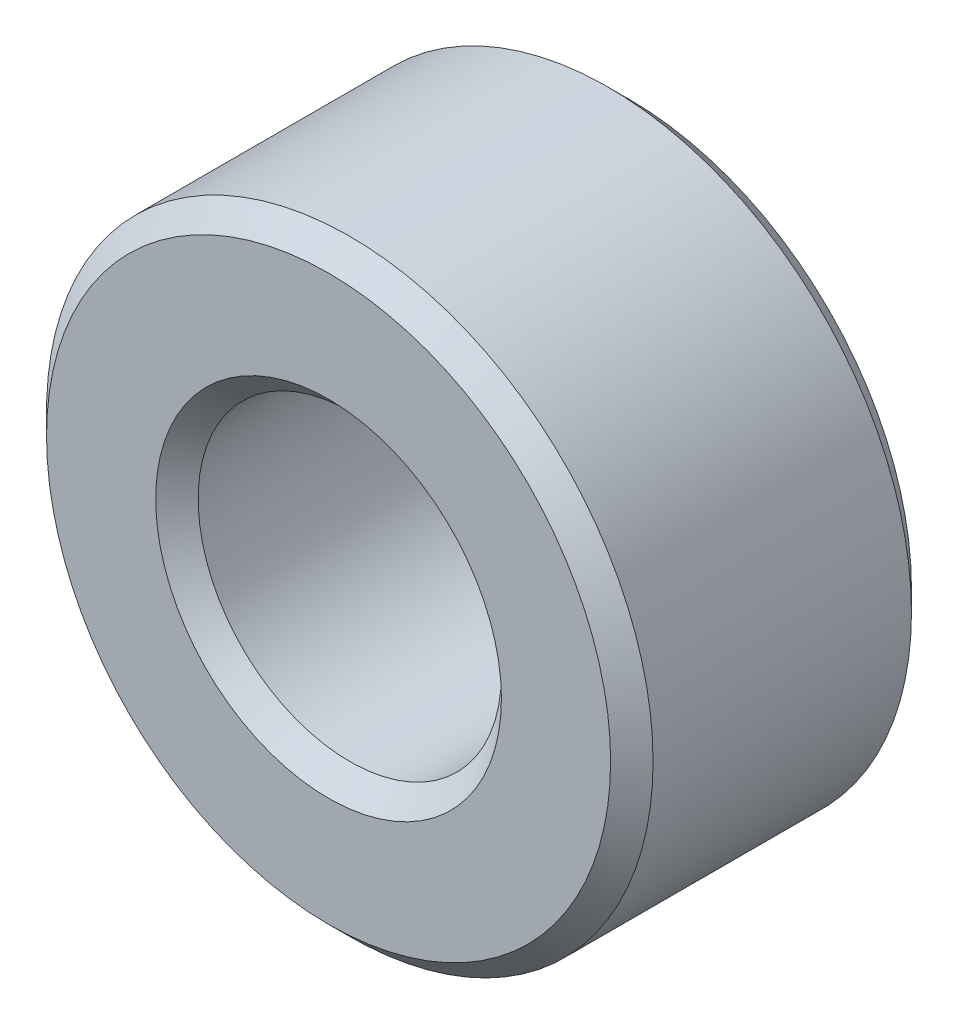
ISO-10303-21;
HEADER;
FILE_DESCRIPTION(('STEP AP214'),'2;1');
FILE_NAME('part.step','',(''),(''),'','','');
FILE_SCHEMA(('AUTOMOTIVE_DESIGN { 1 0 10303 214 1 1 1 1 }'));
ENDSEC;
DATA;
#1=APPLICATION_CONTEXT('core data for automotive mechanical design processes');
#2=APPLICATION_PROTOCOL_DEFINITION('international standard','automotive_design',2000,#1);
#3=PRODUCT_CONTEXT('',#1,'mechanical');
#4=PRODUCT('Part','Part','',(#3));
#5=PRODUCT_RELATED_PRODUCT_CATEGORY('part','',(#4));
#6=PRODUCT_DEFINITION_FORMATION('','',#4);
#7=PRODUCT_DEFINITION_CONTEXT('part definition',#1,'design');
#8=PRODUCT_DEFINITION('design','',#6,#7);
#9=PRODUCT_DEFINITION_SHAPE('','',#8);
#10=(LENGTH_UNIT() NAMED_UNIT(*) SI_UNIT(.MILLI.,.METRE.));
#11=(NAMED_UNIT(*) PLANE_ANGLE_UNIT() SI_UNIT($,.RADIAN.));
#12=(NAMED_UNIT(*) SI_UNIT($,.STERADIAN.) SOLID_ANGLE_UNIT());
#13=UNCERTAINTY_MEASURE_WITH_UNIT(LENGTH_MEASURE(1.E-05),#10,'distance_accuracy_value','');
#14=(GEOMETRIC_REPRESENTATION_CONTEXT(3) GLOBAL_UNCERTAINTY_ASSIGNED_CONTEXT((#13)) GLOBAL_UNIT_ASSIGNED_CONTEXT((#10,
#11,#12)) REPRESENTATION_CONTEXT('',''));
#15=CARTESIAN_POINT('',(0.,0.,0.));
#16=DIRECTION('',(0.,0.,1.));
#17=DIRECTION('',(1.,0.,0.));
#18=AXIS2_PLACEMENT_3D('',#15,#16,#17);
#19=CARTESIAN_POINT('',(0.,0.,-1.5875));
#20=DIRECTION('',(0.,0.,1.));
#21=DIRECTION('',(1.,0.,0.));
#22=AXIS2_PLACEMENT_3D('',#19,#20,#21);
#23=CYLINDRICAL_SURFACE('',#22,3.2004);
#24=CARTESIAN_POINT('',(0.,0.,-1.363472));
#25=DIRECTION('',(0.,0.,1.));
#26=DIRECTION('',(1.,0.,0.));
#27=AXIS2_PLACEMENT_3D('',#24,#25,#26);
#28=CIRCLE('',#27,3.2004);
#29=CARTESIAN_POINT('',(3.2004,0.,-1.363472));
#30=VERTEX_POINT('',#29);
#31=EDGE_CURVE('E76',#30,#30,#28,.T.);
#32=CARTESIAN_POINT('',(0.,0.,1.363472));
#33=DIRECTION('',(0.,0.,1.));
#34=DIRECTION('',(1.,0.,0.));
#35=AXIS2_PLACEMENT_3D('',#32,#33,#34);
#36=CIRCLE('',#35,3.2004);
#37=CARTESIAN_POINT('',(3.2004,0.,1.363472));
#38=VERTEX_POINT('',#37);
#39=EDGE_CURVE('E80',#38,#38,#36,.F.);
#40=CARTESIAN_POINT('',(3.2004,0.,-1.363472));
#41=CARTESIAN_POINT('',(3.2004,0.,-1.33506633333333));
#42=CARTESIAN_POINT('',(3.2004,0.,-1.30666066666666));
#43=CARTESIAN_POINT('',(3.2004,0.,-1.24984933333333));
#44=CARTESIAN_POINT('',(3.2004,0.,-1.22144366666666));
#45=CARTESIAN_POINT('',(3.2004,0.,-1.16463233333333));
#46=CARTESIAN_POINT('',(3.2004,0.,-1.13622666666666));
#47=CARTESIAN_POINT('',(3.2004,0.,-1.07941533333333));
#48=CARTESIAN_POINT('',(3.2004,0.,-1.05100966666666));
#49=CARTESIAN_POINT('',(3.2004,0.,-0.994198333333331));
#50=CARTESIAN_POINT('',(3.2004,0.,-0.965792666666664));
#51=CARTESIAN_POINT('',(3.2004,0.,-0.908981333333331));
#52=CARTESIAN_POINT('',(3.2004,0.,-0.880575666666664));
#53=CARTESIAN_POINT('',(3.2004,0.,-0.823764333333331));
#54=CARTESIAN_POINT('',(3.2004,0.,-0.795358666666664));
#55=CARTESIAN_POINT('',(3.2004,0.,-0.738547333333331));
#56=CARTESIAN_POINT('',(3.2004,0.,-0.710141666666664));
#57=CARTESIAN_POINT('',(3.2004,0.,-0.653330333333331));
#58=CARTESIAN_POINT('',(3.2004,0.,-0.624924666666664));
#59=CARTESIAN_POINT('',(3.2004,0.,-0.568113333333331));
#60=CARTESIAN_POINT('',(3.2004,0.,-0.539707666666665));
#61=CARTESIAN_POINT('',(3.2004,0.,-0.482896333333331));
#62=CARTESIAN_POINT('',(3.2004,0.,-0.454490666666665));
#63=CARTESIAN_POINT('',(3.2004,0.,-0.397679333333332));
#64=CARTESIAN_POINT('',(3.2004,0.,-0.369273666666665));
#65=CARTESIAN_POINT('',(3.2004,0.,-0.312462333333332));
#66=CARTESIAN_POINT('',(3.2004,0.,-0.284056666666665));
#67=CARTESIAN_POINT('',(3.2004,0.,-0.227245333333332));
#68=CARTESIAN_POINT('',(3.2004,0.,-0.198839666666665));
#69=CARTESIAN_POINT('',(3.2004,0.,-0.142028333333332));
#70=CARTESIAN_POINT('',(3.2004,0.,-0.113622666666665));
#71=CARTESIAN_POINT('',(3.2004,0.,-0.0568113333333317));
#72=CARTESIAN_POINT('',(3.2004,0.,-0.0284056666666651));
#73=CARTESIAN_POINT('',(3.2004,0.,0.0284056666666681));
#74=CARTESIAN_POINT('',(3.2004,0.,0.0568113333333348));
#75=CARTESIAN_POINT('',(3.2004,0.,0.113622666666668));
#76=CARTESIAN_POINT('',(3.2004,0.,0.142028333333335));
#77=CARTESIAN_POINT('',(3.2004,0.,0.198839666666668));
#78=CARTESIAN_POINT('',(3.2004,0.,0.227245333333334));
#79=CARTESIAN_POINT('',(3.2004,0.,0.284056666666668));
#80=CARTESIAN_POINT('',(3.2004,0.,0.312462333333334));
#81=CARTESIAN_POINT('',(3.2004,0.,0.369273666666667));
#82=CARTESIAN_POINT('',(3.2004,0.,0.397679333333334));
#83=CARTESIAN_POINT('',(3.2004,0.,0.454490666666667));
#84=CARTESIAN_POINT('',(3.2004,0.,0.482896333333334));
#85=CARTESIAN_POINT('',(3.2004,0.,0.539707666666667));
#86=CARTESIAN_POINT('',(3.2004,0.,0.568113333333334));
#87=CARTESIAN_POINT('',(3.2004,0.,0.624924666666667));
#88=CARTESIAN_POINT('',(3.2004,0.,0.653330333333334));
#89=CARTESIAN_POINT('',(3.2004,0.,0.710141666666667));
#90=CARTESIAN_POINT('',(3.2004,0.,0.738547333333334));
#91=CARTESIAN_POINT('',(3.2004,0.,0.795358666666667));
#92=CARTESIAN_POINT('',(3.2004,0.,0.823764333333334));
#93=CARTESIAN_POINT('',(3.2004,0.,0.880575666666667));
#94=CARTESIAN_POINT('',(3.2004,0.,0.908981333333333));
#95=CARTESIAN_POINT('',(3.2004,0.,0.965792666666667));
#96=CARTESIAN_POINT('',(3.2004,0.,0.994198333333334));
#97=CARTESIAN_POINT('',(3.2004,0.,1.05100966666667));
#98=CARTESIAN_POINT('',(3.2004,0.,1.07941533333333));
#99=CARTESIAN_POINT('',(3.2004,0.,1.13622666666667));
#100=CARTESIAN_POINT('',(3.2004,0.,1.16463233333333));
#101=CARTESIAN_POINT('',(3.2004,0.,1.22144366666667));
#102=CARTESIAN_POINT('',(3.2004,0.,1.24984933333333));
#103=CARTESIAN_POINT('',(3.2004,0.,1.30666066666667));
#104=CARTESIAN_POINT('',(3.2004,0.,1.33506633333333));
#105=CARTESIAN_POINT('',(3.2004,0.,1.363472));
#106=B_SPLINE_CURVE_WITH_KNOTS('',3,(#40,#41,#42,#43,#44,#45,#46,#47,#48,#49,#50,#51,#52,#53,
#54,#55,#56,#57,#58,#59,#60,#61,#62,#63,#64,#65,#66,#67,#68,#69,#70,#71,#72,#73,#74,#75,#76,#77,
#78,#79,#80,#81,#82,#83,#84,#85,#86,#87,#88,#89,#90,#91,#92,#93,#94,#95,#96,#97,#98,#99,#100,
#101,#102,#103,#104,#105),.UNSPECIFIED.,.F.,.F.,(4,2,2,2,2,2,2,2,2,2,2,2,2,2,2,2,2,2,2,2,2,2,2,
2,2,2,2,2,2,2,2,2,4),(0.,0.0852170000000001,0.170434,0.255651,0.340868,0.426085,
0.511301999999999,0.596518999999999,0.681735999999999,0.766952999999999,0.852169999999999,
0.937386999999999,1.022604,1.107821,1.193038,1.278255,1.363472,1.448689,1.533906,1.619123,
1.70434,1.789557,1.874774,1.959991,2.045208,2.130425,2.215642,2.300859,2.386076,2.471293,
2.55651,2.641727,2.726944),.UNSPECIFIED.);
#107=EDGE_CURVE('BSEAM41',#30,#38,#106,.T.);
#108=ORIENTED_EDGE('',*,*,#31,.T.);
#109=ORIENTED_EDGE('',*,*,#39,.T.);
#110=ORIENTED_EDGE('',*,*,#107,.T.);
#111=ORIENTED_EDGE('',*,*,#107,.F.);
#112=EDGE_LOOP('',(#108,#110,#109,#111));
#113=FACE_BOUND('',#112,.T.);
#114=ADVANCED_FACE('F41',(#113),#23,.T.);
#115=CARTESIAN_POINT('',(0.,0.,-1.5875));
#116=DIRECTION('',(0.,0.,1.));
#117=DIRECTION('',(1.,0.,0.));
#118=AXIS2_PLACEMENT_3D('',#115,#116,#117);
#119=PLANE('',#118);
#120=CARTESIAN_POINT('',(0.,0.,-1.5875));
#121=DIRECTION('',(0.,0.,1.));
#122=DIRECTION('',(1.,0.,0.));
#123=AXIS2_PLACEMENT_3D('',#120,#121,#122);
#124=CIRCLE('',#123,2.97637199999999);
#125=CARTESIAN_POINT('',(2.97637199999999,0.,-1.5875));
#126=VERTEX_POINT('',#125);
#127=EDGE_CURVE('E68',#126,#126,#124,.F.);
#128=ORIENTED_EDGE('',*,*,#127,.T.);
#129=EDGE_LOOP('',(#128));
#130=FACE_BOUND('',#129,.T.);
#131=CARTESIAN_POINT('',(0.,0.,-1.5875));
#132=DIRECTION('',(0.,0.,1.));
#133=DIRECTION('',(1.,0.,0.));
#134=AXIS2_PLACEMENT_3D('',#131,#132,#133);
#135=CIRCLE('',#134,1.824228);
#136=CARTESIAN_POINT('',(1.824228,0.,-1.5875));
#137=VERTEX_POINT('',#136);
#138=EDGE_CURVE('E72',#137,#137,#135,.T.);
#139=ORIENTED_EDGE('',*,*,#138,.T.);
#140=EDGE_LOOP('',(#139));
#141=FACE_BOUND('',#140,.T.);
#142=ADVANCED_FACE('F96',(#130,#141),#119,.F.);
#143=CARTESIAN_POINT('',(0.,0.,-1.5875));
#144=DIRECTION('',(0.,0.,1.));
#145=DIRECTION('',(1.,0.,0.));
#146=AXIS2_PLACEMENT_3D('',#143,#144,#145);
#147=CYLINDRICAL_SURFACE('',#146,1.6002);
#148=CARTESIAN_POINT('',(0.,0.,-1.363472));
#149=DIRECTION('',(0.,0.,1.));
#150=DIRECTION('',(1.,0.,0.));
#151=AXIS2_PLACEMENT_3D('',#148,#149,#150);
#152=CIRCLE('',#151,1.6002);
#153=CARTESIAN_POINT('',(1.6002,0.,-1.363472));
#154=VERTEX_POINT('',#153);
#155=EDGE_CURVE('E56',#154,#154,#152,.F.);
#156=CARTESIAN_POINT('',(0.,0.,1.36347199999999));
#157=DIRECTION('',(0.,0.,1.));
#158=DIRECTION('',(1.,0.,0.));
#159=AXIS2_PLACEMENT_3D('',#156,#157,#158);
#160=CIRCLE('',#159,1.6002);
#161=CARTESIAN_POINT('',(1.6002,0.,1.36347199999999));
#162=VERTEX_POINT('',#161);
#163=EDGE_CURVE('E62',#162,#162,#160,.T.);
#164=CARTESIAN_POINT('',(1.6002,0.,-1.363472));
#165=CARTESIAN_POINT('',(1.6002,0.,-1.33506633333334));
#166=CARTESIAN_POINT('',(1.6002,0.,-1.30666066666667));
#167=CARTESIAN_POINT('',(1.6002,0.,-1.24984933333334));
#168=CARTESIAN_POINT('',(1.6002,0.,-1.22144366666667));
#169=CARTESIAN_POINT('',(1.6002,0.,-1.16463233333334));
#170=CARTESIAN_POINT('',(1.6002,0.,-1.13622666666667));
#171=CARTESIAN_POINT('',(1.6002,0.,-1.07941533333334));
#172=CARTESIAN_POINT('',(1.6002,0.,-1.05100966666667));
#173=CARTESIAN_POINT('',(1.6002,0.,-0.994198333333337));
#174=CARTESIAN_POINT('',(1.6002,0.,-0.96579266666667));
#175=CARTESIAN_POINT('',(1.6002,0.,-0.908981333333337));
#176=CARTESIAN_POINT('',(1.6002,0.,-0.88057566666667));
#177=CARTESIAN_POINT('',(1.6002,0.,-0.823764333333337));
#178=CARTESIAN_POINT('',(1.6002,0.,-0.79535866666667));
#179=CARTESIAN_POINT('',(1.6002,0.,-0.738547333333337));
#180=CARTESIAN_POINT('',(1.6002,0.,-0.71014166666667));
#181=CARTESIAN_POINT('',(1.6002,0.,-0.653330333333337));
#182=CARTESIAN_POINT('',(1.6002,0.,-0.62492466666667));
#183=CARTESIAN_POINT('',(1.6002,0.,-0.568113333333337));
#184=CARTESIAN_POINT('',(1.6002,0.,-0.539707666666671));
#185=CARTESIAN_POINT('',(1.6002,0.,-0.482896333333337));
#186=CARTESIAN_POINT('',(1.6002,0.,-0.454490666666671));
#187=CARTESIAN_POINT('',(1.6002,0.,-0.397679333333337));
#188=CARTESIAN_POINT('',(1.6002,0.,-0.369273666666671));
#189=CARTESIAN_POINT('',(1.6002,0.,-0.312462333333338));
#190=CARTESIAN_POINT('',(1.6002,0.,-0.284056666666671));
#191=CARTESIAN_POINT('',(1.6002,0.,-0.227245333333338));
#192=CARTESIAN_POINT('',(1.6002,0.,-0.198839666666671));
#193=CARTESIAN_POINT('',(1.6002,0.,-0.142028333333338));
#194=CARTESIAN_POINT('',(1.6002,0.,-0.113622666666671));
#195=CARTESIAN_POINT('',(1.6002,0.,-0.056811333333338));
#196=CARTESIAN_POINT('',(1.6002,0.,-0.0284056666666714));
#197=CARTESIAN_POINT('',(1.6002,0.,0.0284056666666618));
#198=CARTESIAN_POINT('',(1.6002,0.,0.0568113333333285));
#199=CARTESIAN_POINT('',(1.6002,0.,0.113622666666662));
#200=CARTESIAN_POINT('',(1.6002,0.,0.142028333333328));
#201=CARTESIAN_POINT('',(1.6002,0.,0.198839666666662));
#202=CARTESIAN_POINT('',(1.6002,0.,0.227245333333328));
#203=CARTESIAN_POINT('',(1.6002,0.,0.284056666666661));
#204=CARTESIAN_POINT('',(1.6002,0.,0.312462333333328));
#205=CARTESIAN_POINT('',(1.6002,0.,0.369273666666661));
#206=CARTESIAN_POINT('',(1.6002,0.,0.397679333333328));
#207=CARTESIAN_POINT('',(1.6002,0.,0.454490666666661));
#208=CARTESIAN_POINT('',(1.6002,0.,0.482896333333328));
#209=CARTESIAN_POINT('',(1.6002,0.,0.539707666666661));
#210=CARTESIAN_POINT('',(1.6002,0.,0.568113333333327));
#211=CARTESIAN_POINT('',(1.6002,0.,0.62492466666666));
#212=CARTESIAN_POINT('',(1.6002,0.,0.653330333333327));
#213=CARTESIAN_POINT('',(1.6002,0.,0.710141666666661));
#214=CARTESIAN_POINT('',(1.6002,0.,0.738547333333327));
#215=CARTESIAN_POINT('',(1.6002,0.,0.79535866666666));
#216=CARTESIAN_POINT('',(1.6002,0.,0.823764333333327));
#217=CARTESIAN_POINT('',(1.6002,0.,0.88057566666666));
#218=CARTESIAN_POINT('',(1.6002,0.,0.908981333333327));
#219=CARTESIAN_POINT('',(1.6002,0.,0.96579266666666));
#220=CARTESIAN_POINT('',(1.6002,0.,0.994198333333327));
#221=CARTESIAN_POINT('',(1.6002,0.,1.05100966666666));
#222=CARTESIAN_POINT('',(1.6002,0.,1.07941533333333));
#223=CARTESIAN_POINT('',(1.6002,0.,1.13622666666666));
#224=CARTESIAN_POINT('',(1.6002,0.,1.16463233333333));
#225=CARTESIAN_POINT('',(1.6002,0.,1.22144366666666));
#226=CARTESIAN_POINT('',(1.6002,0.,1.24984933333333));
#227=CARTESIAN_POINT('',(1.6002,0.,1.30666066666666));
#228=CARTESIAN_POINT('',(1.6002,0.,1.33506633333333));
#229=CARTESIAN_POINT('',(1.6002,0.,1.36347199999999));
#230=B_SPLINE_CURVE_WITH_KNOTS('',3,(#164,#165,#166,#167,#168,#169,#170,#171,#172,#173,#174,
#175,#176,#177,#178,#179,#180,#181,#182,#183,#184,#185,#186,#187,#188,#189,#190,#191,#192,#193,
#194,#195,#196,#197,#198,#199,#200,#201,#202,#203,#204,#205,#206,#207,#208,#209,#210,#211,#212,
#213,#214,#215,#216,#217,#218,#219,#220,#221,#222,#223,#224,#225,#226,#227,#228,#229),
.UNSPECIFIED.,.F.,.F.,(4,2,2,2,2,2,2,2,2,2,2,2,2,2,2,2,2,2,2,2,2,2,2,2,2,2,2,2,2,2,2,2,4),(0.,
0.0852169999999998,0.170434,0.255651,0.340867999999999,0.426084999999999,0.511301999999999,
0.596518999999999,0.681735999999999,0.766952999999999,0.852169999999998,0.937386999999998,
1.022604,1.107821,1.193038,1.278255,1.363472,1.448689,1.533906,1.619123,1.70434,1.789557,
1.874774,1.959991,2.045208,2.130425,2.215642,2.300859,2.386076,2.471293,2.55651,2.641727,
2.726944),.UNSPECIFIED.);
#231=EDGE_CURVE('BSEAM102',#154,#162,#230,.T.);
#232=ORIENTED_EDGE('',*,*,#155,.T.);
#233=ORIENTED_EDGE('',*,*,#163,.T.);
#234=ORIENTED_EDGE('',*,*,#231,.T.);
#235=ORIENTED_EDGE('',*,*,#231,.F.);
#236=EDGE_LOOP('',(#232,#234,#233,#235));
#237=FACE_BOUND('',#236,.T.);
#238=ADVANCED_FACE('F102',(#237),#147,.F.);
#239=CARTESIAN_POINT('',(0.,0.,1.5875));
#240=DIRECTION('',(0.,0.,1.));
#241=DIRECTION('',(1.,0.,0.));
#242=AXIS2_PLACEMENT_3D('',#239,#240,#241);
#243=PLANE('',#242);
#244=CARTESIAN_POINT('',(0.,0.,1.5875));
#245=DIRECTION('',(0.,0.,1.));
#246=DIRECTION('',(1.,0.,0.));
#247=AXIS2_PLACEMENT_3D('',#244,#245,#246);
#248=CIRCLE('',#247,1.82422800000001);
#249=CARTESIAN_POINT('',(1.82422800000001,0.,1.5875));
#250=VERTEX_POINT('',#249);
#251=EDGE_CURVE('E10',#250,#250,#248,.F.);
#252=ORIENTED_EDGE('',*,*,#251,.T.);
#253=EDGE_LOOP('',(#252));
#254=FACE_BOUND('',#253,.T.);
#255=CARTESIAN_POINT('',(0.,0.,1.5875));
#256=DIRECTION('',(0.,0.,1.));
#257=DIRECTION('',(1.,0.,0.));
#258=AXIS2_PLACEMENT_3D('',#255,#256,#257);
#259=CIRCLE('',#258,2.976372);
#260=CARTESIAN_POINT('',(2.976372,0.,1.5875));
#261=VERTEX_POINT('',#260);
#262=EDGE_CURVE('E50',#261,#261,#259,.T.);
#263=ORIENTED_EDGE('',*,*,#262,.T.);
#264=EDGE_LOOP('',(#263));
#265=FACE_BOUND('',#264,.T.);
#266=ADVANCED_FACE('F114',(#254,#265),#243,.T.);
#267=CARTESIAN_POINT('',(0.,0.,-1.363472));
#268=DIRECTION('',(0.,0.,1.));
#269=DIRECTION('',(1.,0.,0.));
#270=AXIS2_PLACEMENT_3D('',#267,#268,#269);
#271=CONICAL_SURFACE('',#270,3.2004,0.78539816339745);
#272=CARTESIAN_POINT('',(2.97637199999999,0.,-1.5875));
#273=CARTESIAN_POINT('',(2.97870562499999,0.,-1.585166375));
#274=CARTESIAN_POINT('',(2.98103924999999,0.,-1.58283275));
#275=CARTESIAN_POINT('',(2.98570649999999,0.,-1.5781655));
#276=CARTESIAN_POINT('',(2.98804012499999,0.,-1.575831875));
#277=CARTESIAN_POINT('',(2.99270737499999,0.,-1.571164625));
#278=CARTESIAN_POINT('',(2.99504099999999,0.,-1.568831));
#279=CARTESIAN_POINT('',(2.99970824999999,0.,-1.56416375));
#280=CARTESIAN_POINT('',(3.00204187499999,0.,-1.561830125));
#281=CARTESIAN_POINT('',(3.00670912499999,0.,-1.557162875));
#282=CARTESIAN_POINT('',(3.00904274999999,0.,-1.55482925));
#283=CARTESIAN_POINT('',(3.01370999999999,0.,-1.550162));
#284=CARTESIAN_POINT('',(3.01604362499999,0.,-1.547828375));
#285=CARTESIAN_POINT('',(3.02071087499999,0.,-1.543161125));
#286=CARTESIAN_POINT('',(3.02304449999999,0.,-1.5408275));
#287=CARTESIAN_POINT('',(3.02771175,0.,-1.53616025));
#288=CARTESIAN_POINT('',(3.03004537499999,0.,-1.533826625));
#289=CARTESIAN_POINT('',(3.034712625,0.,-1.529159375));
#290=CARTESIAN_POINT('',(3.03704625,0.,-1.52682575));
#291=CARTESIAN_POINT('',(3.0417135,0.,-1.5221585));
#292=CARTESIAN_POINT('',(3.044047125,0.,-1.519824875));
#293=CARTESIAN_POINT('',(3.048714375,0.,-1.515157625));
#294=CARTESIAN_POINT('',(3.051048,0.,-1.512824));
#295=CARTESIAN_POINT('',(3.05571525,0.,-1.50815675));
#296=CARTESIAN_POINT('',(3.058048875,0.,-1.505823125));
#297=CARTESIAN_POINT('',(3.062716125,0.,-1.501155875));
#298=CARTESIAN_POINT('',(3.06504975,0.,-1.49882225));
#299=CARTESIAN_POINT('',(3.069717,0.,-1.494155));
#300=CARTESIAN_POINT('',(3.072050625,0.,-1.491821375));
#301=CARTESIAN_POINT('',(3.076717875,0.,-1.487154125));
#302=CARTESIAN_POINT('',(3.0790515,0.,-1.4848205));
#303=CARTESIAN_POINT('',(3.08371875,0.,-1.48015325));
#304=CARTESIAN_POINT('',(3.086052375,0.,-1.477819625));
#305=CARTESIAN_POINT('',(3.090719625,0.,-1.473152375));
#306=CARTESIAN_POINT('',(3.09305325,0.,-1.47081875));
#307=CARTESIAN_POINT('',(3.0977205,0.,-1.4661515));
#308=CARTESIAN_POINT('',(3.100054125,0.,-1.463817875));
#309=CARTESIAN_POINT('',(3.104721375,0.,-1.459150625));
#310=CARTESIAN_POINT('',(3.107055,0.,-1.456817));
#311=CARTESIAN_POINT('',(3.11172225,0.,-1.45214975));
#312=CARTESIAN_POINT('',(3.114055875,0.,-1.449816125));
#313=CARTESIAN_POINT('',(3.118723125,0.,-1.445148875));
#314=CARTESIAN_POINT('',(3.12105675,0.,-1.44281525));
#315=CARTESIAN_POINT('',(3.125724,0.,-1.438148));
#316=CARTESIAN_POINT('',(3.128057625,0.,-1.435814375));
#317=CARTESIAN_POINT('',(3.132724875,0.,-1.431147125));
#318=CARTESIAN_POINT('',(3.1350585,0.,-1.4288135));
#319=CARTESIAN_POINT('',(3.13972575,0.,-1.42414625));
#320=CARTESIAN_POINT('',(3.142059375,0.,-1.421812625));
#321=CARTESIAN_POINT('',(3.146726625,0.,-1.417145375));
#322=CARTESIAN_POINT('',(3.14906025,0.,-1.41481175));
#323=CARTESIAN_POINT('',(3.1537275,0.,-1.4101445));
#324=CARTESIAN_POINT('',(3.156061125,0.,-1.407810875));
#325=CARTESIAN_POINT('',(3.160728375,0.,-1.403143625));
#326=CARTESIAN_POINT('',(3.163062,0.,-1.40081));
#327=CARTESIAN_POINT('',(3.16772925,0.,-1.39614275));
#328=CARTESIAN_POINT('',(3.170062875,0.,-1.393809125));
#329=CARTESIAN_POINT('',(3.174730125,0.,-1.389141875));
#330=CARTESIAN_POINT('',(3.17706375,0.,-1.38680825));
#331=CARTESIAN_POINT('',(3.181731,0.,-1.382141));
#332=CARTESIAN_POINT('',(3.184064625,0.,-1.379807375));
#333=CARTESIAN_POINT('',(3.188731875,0.,-1.375140125));
#334=CARTESIAN_POINT('',(3.1910655,0.,-1.3728065));
#335=CARTESIAN_POINT('',(3.19573275,0.,-1.36813925));
#336=CARTESIAN_POINT('',(3.198066375,0.,-1.365805625));
#337=CARTESIAN_POINT('',(3.2004,0.,-1.363472));
#338=B_SPLINE_CURVE_WITH_KNOTS('',3,(#272,#273,#274,#275,#276,#277,#278,#279,#280,#281,#282,
#283,#284,#285,#286,#287,#288,#289,#290,#291,#292,#293,#294,#295,#296,#297,#298,#299,#300,#301,
#302,#303,#304,#305,#306,#307,#308,#309,#310,#311,#312,#313,#314,#315,#316,#317,#318,#319,#320,
#321,#322,#323,#324,#325,#326,#327,#328,#329,#330,#331,#332,#333,#334,#335,#336,#337),
.UNSPECIFIED.,.F.,.F.,(4,2,2,2,2,2,2,2,2,2,2,2,2,2,2,2,2,2,2,2,2,2,2,2,2,2,2,2,2,2,2,2,4),(0.,
0.00990073237347894,0.0198014647469579,0.029702197120437,0.0396029294939159,0.0495036618673947,
0.059404394240874,0.0693051266143529,0.079205858987832,0.089106591361311,0.0990073237347899,
0.108908056108269,0.118808788481748,0.128709520855227,0.138610253228706,0.148510985602185,
0.158411717975664,0.168312450349143,0.178213182722622,0.188113915096101,0.19801464746958,
0.207915379843059,0.217816112216538,0.227716844590017,0.237617576963496,0.247518309336975,
0.257419041710454,0.267319774083933,0.277220506457412,0.287121238830891,0.29702197120437,
0.306922703577849,0.316823435951328),.UNSPECIFIED.);
#339=EDGE_CURVE('BSEAM108',#126,#30,#338,.T.);
#340=ORIENTED_EDGE('',*,*,#127,.F.);
#341=ORIENTED_EDGE('',*,*,#31,.F.);
#342=ORIENTED_EDGE('',*,*,#339,.T.);
#343=ORIENTED_EDGE('',*,*,#339,.F.);
#344=EDGE_LOOP('',(#340,#342,#341,#343));
#345=FACE_BOUND('',#344,.T.);
#346=ADVANCED_FACE('F108',(#345),#271,.T.);
#347=CARTESIAN_POINT('',(0.,0.,-1.5875));
#348=DIRECTION('',(0.,0.,-1.));
#349=DIRECTION('',(-1.,0.,0.));
#350=AXIS2_PLACEMENT_3D('',#347,#348,#349);
#351=CONICAL_SURFACE('',#350,1.824228,0.785398163397445);
#352=ORIENTED_EDGE('',*,*,#155,.F.);
#353=EDGE_LOOP('',(#352));
#354=FACE_BOUND('',#353,.T.);
#355=ORIENTED_EDGE('',*,*,#138,.F.);
#356=EDGE_LOOP('',(#355));
#357=FACE_BOUND('',#356,.T.);
#358=ADVANCED_FACE('F93',(#354,#357),#351,.F.);
#359=CARTESIAN_POINT('',(0.,0.,1.36347199999999));
#360=DIRECTION('',(0.,0.,1.));
#361=DIRECTION('',(1.,0.,0.));
#362=AXIS2_PLACEMENT_3D('',#359,#360,#361);
#363=CONICAL_SURFACE('',#362,1.6002,0.785398163397452);
#364=ORIENTED_EDGE('',*,*,#251,.F.);
#365=EDGE_LOOP('',(#364));
#366=FACE_BOUND('',#365,.T.);
#367=ORIENTED_EDGE('',*,*,#163,.F.);
#368=EDGE_LOOP('',(#367));
#369=FACE_BOUND('',#368,.T.);
#370=ADVANCED_FACE('F89',(#366,#369),#363,.F.);
#371=CARTESIAN_POINT('',(0.,0.,1.5875));
#372=DIRECTION('',(0.,0.,-1.));
#373=DIRECTION('',(-1.,0.,0.));
#374=AXIS2_PLACEMENT_3D('',#371,#372,#373);
#375=CONICAL_SURFACE('',#374,2.976372,0.785398163397445);
#376=ORIENTED_EDGE('',*,*,#39,.F.);
#377=EDGE_LOOP('',(#376));
#378=FACE_BOUND('',#377,.T.);
#379=ORIENTED_EDGE('',*,*,#262,.F.);
#380=EDGE_LOOP('',(#379));
#381=FACE_BOUND('',#380,.T.);
#382=ADVANCED_FACE('F44',(#378,#381),#375,.T.);
#383=CLOSED_SHELL('',(#114,#142,#238,#266,#346,#358,#370,#382));
#384=MANIFOLD_SOLID_BREP('B2',#383);
#385=ADVANCED_BREP_SHAPE_REPRESENTATION('',(#18,#384),#14);
#386=SHAPE_DEFINITION_REPRESENTATION(#9,#385);
ENDSEC;
END-ISO-10303-21;
